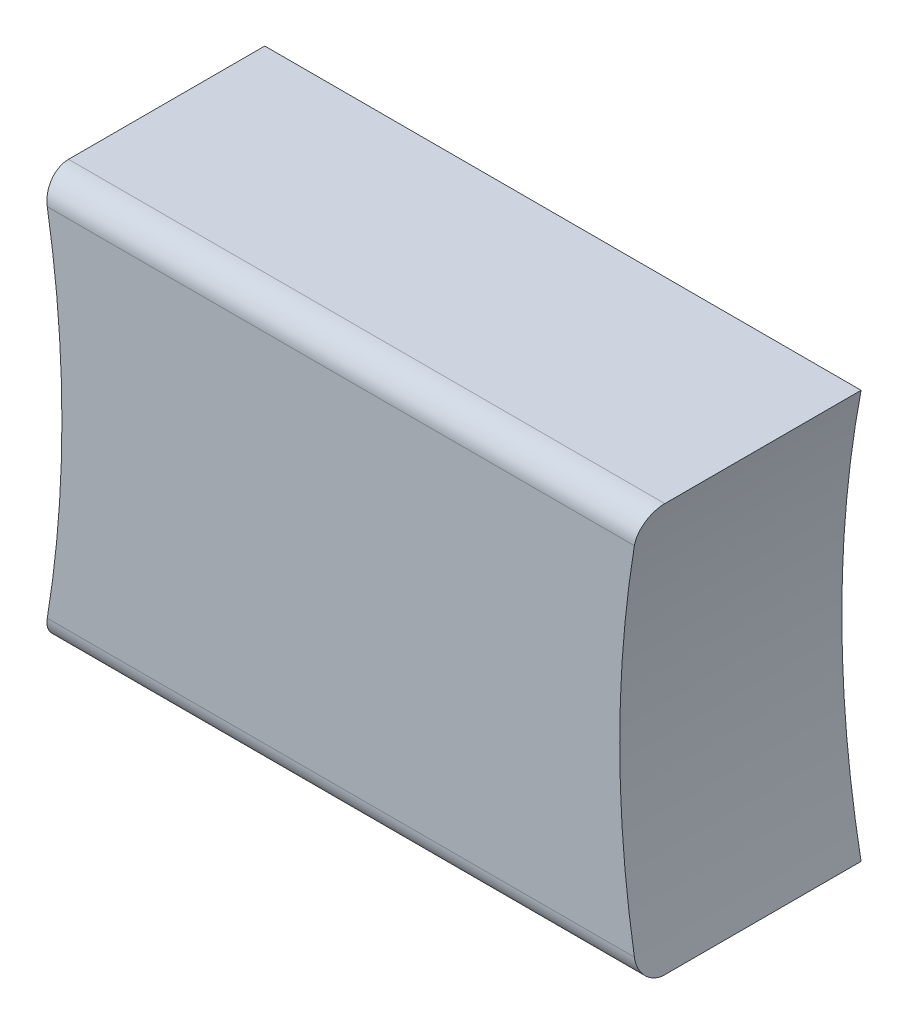
ISO-10303-21;
HEADER;
FILE_DESCRIPTION(('STEP AP214'),'2;1');
FILE_NAME('part.step','',(''),(''),'','','');
FILE_SCHEMA(('AUTOMOTIVE_DESIGN { 1 0 10303 214 1 1 1 1 }'));
ENDSEC;
DATA;
#1=APPLICATION_CONTEXT('core data for automotive mechanical design processes');
#2=APPLICATION_PROTOCOL_DEFINITION('international standard','automotive_design',2000,#1);
#3=PRODUCT_CONTEXT('',#1,'mechanical');
#4=PRODUCT('Part','Part','',(#3));
#5=PRODUCT_RELATED_PRODUCT_CATEGORY('part','',(#4));
#6=PRODUCT_DEFINITION_FORMATION('','',#4);
#7=PRODUCT_DEFINITION_CONTEXT('part definition',#1,'design');
#8=PRODUCT_DEFINITION('design','',#6,#7);
#9=PRODUCT_DEFINITION_SHAPE('','',#8);
#10=(LENGTH_UNIT() NAMED_UNIT(*) SI_UNIT(.MILLI.,.METRE.));
#11=(NAMED_UNIT(*) PLANE_ANGLE_UNIT() SI_UNIT($,.RADIAN.));
#12=(NAMED_UNIT(*) SI_UNIT($,.STERADIAN.) SOLID_ANGLE_UNIT());
#13=UNCERTAINTY_MEASURE_WITH_UNIT(LENGTH_MEASURE(1.E-05),#10,'distance_accuracy_value','');
#14=(GEOMETRIC_REPRESENTATION_CONTEXT(3) GLOBAL_UNCERTAINTY_ASSIGNED_CONTEXT((#13)) GLOBAL_UNIT_ASSIGNED_CONTEXT((#10,
#11,#12)) REPRESENTATION_CONTEXT('',''));
#15=CARTESIAN_POINT('',(0.,0.,0.));
#16=DIRECTION('',(0.,0.,1.));
#17=DIRECTION('',(1.,0.,0.));
#18=AXIS2_PLACEMENT_3D('',#15,#16,#17);
#19=CARTESIAN_POINT('',(0.,0.,0.96));
#20=DIRECTION('',(0.,0.,1.));
#21=DIRECTION('',(1.,0.,0.));
#22=AXIS2_PLACEMENT_3D('',#19,#20,#21);
#23=PLANE('',#22);
#24=CARTESIAN_POINT('',(5.306675110214,0.,0.96));
#25=DIRECTION('',(0.,0.,1.));
#26=DIRECTION('',(1.,0.,0.));
#27=AXIS2_PLACEMENT_3D('',#24,#25,#26);
#28=CIRCLE('',#27,4.226675110214);
#29=CARTESIAN_POINT('',(1.13670119095473,-0.69,0.96));
#30=VERTEX_POINT('',#29);
#31=CARTESIAN_POINT('',(1.13670119095473,0.69,0.96));
#32=VERTEX_POINT('',#31);
#33=EDGE_CURVE('E76',#30,#32,#28,.F.);
#34=ORIENTED_EDGE('',*,*,#33,.T.);
#35=DIRECTION('',(-1.,0.,0.));
#36=VECTOR('',#35,1.);
#37=CARTESIAN_POINT('',(0.8,0.69,0.96));
#38=LINE('',#37,#36);
#39=CARTESIAN_POINT('',(-1.13670119095473,0.69,0.96));
#40=VERTEX_POINT('',#39);
#41=EDGE_CURVE('E78',#40,#32,#38,.F.);
#42=ORIENTED_EDGE('',*,*,#41,.F.);
#43=CARTESIAN_POINT('',(-5.306675110214,0.,0.96));
#44=DIRECTION('',(0.,0.,1.));
#45=DIRECTION('',(1.,0.,0.));
#46=AXIS2_PLACEMENT_3D('',#43,#44,#45);
#47=CIRCLE('',#46,4.226675110214);
#48=CARTESIAN_POINT('',(-1.13670119095473,-0.690000000000022,0.96));
#49=VERTEX_POINT('',#48);
#50=EDGE_CURVE('E20',#40,#49,#47,.F.);
#51=ORIENTED_EDGE('',*,*,#50,.T.);
#52=DIRECTION('',(1.,0.,0.));
#53=VECTOR('',#52,1.);
#54=CARTESIAN_POINT('',(-0.8,-0.69,0.96));
#55=LINE('',#54,#53);
#56=EDGE_CURVE('E82',#30,#49,#55,.F.);
#57=ORIENTED_EDGE('',*,*,#56,.F.);
#58=EDGE_LOOP('',(#34,#42,#51,#57));
#59=FACE_BOUND('',#58,.T.);
#60=ADVANCED_FACE('F17',(#59),#23,.T.);
#61=CARTESIAN_POINT('',(-0.8,-0.69,0.86));
#62=DIRECTION('',(1.,0.,0.));
#63=DIRECTION('',(0.,1.,0.));
#64=AXIS2_PLACEMENT_3D('',#61,#62,#63);
#65=CYLINDRICAL_SURFACE('',#64,0.1);
#66=CARTESIAN_POINT('',(1.15448502698051,-0.79,0.86));
#67=CARTESIAN_POINT('',(1.15448631273305,-0.790005087146856,0.865556849639631));
#68=CARTESIAN_POINT('',(1.15439696772321,-0.789537143585381,0.871111614982859));
#69=CARTESIAN_POINT('',(1.15404666825362,-0.787693522979548,0.88205561211761));
#70=CARTESIAN_POINT('',(1.15378594045839,-0.786319044876082,0.887445052721079));
#71=CARTESIAN_POINT('',(1.15310238228103,-0.782699977102862,0.897914027570781));
#72=CARTESIAN_POINT('',(1.15267950514041,-0.780455136447335,0.902993471934174));
#73=CARTESIAN_POINT('',(1.15168915351814,-0.775165432988514,0.912700914484045));
#74=CARTESIAN_POINT('',(1.15112168197221,-0.77212058642789,0.917328921833518));
#75=CARTESIAN_POINT('',(1.14985867669438,-0.765291925059744,0.926045724651077));
#76=CARTESIAN_POINT('',(1.14916212522611,-0.761502221892582,0.930129757421531));
#77=CARTESIAN_POINT('',(1.147669745872,-0.753308820601576,0.937606435921475));
#78=CARTESIAN_POINT('',(1.14687389469198,-0.748904978381558,0.94099891893062));
#79=CARTESIAN_POINT('',(1.14519704768687,-0.739530821716076,0.947053709019323));
#80=CARTESIAN_POINT('',(1.14431486930304,-0.734552399877286,0.949703125369265));
#81=CARTESIAN_POINT('',(1.14250631710719,-0.724229350416601,0.954126784718131));
#82=CARTESIAN_POINT('',(1.1415799614916,-0.718884873182395,0.955901384693343));
#83=CARTESIAN_POINT('',(1.13998951770043,-0.709597645176679,0.958140330856203));
#84=CARTESIAN_POINT('',(1.13932902421101,-0.705708628600776,0.958837085209216));
#85=CARTESIAN_POINT('',(1.13801091925601,-0.69788056027493,0.959766918087541));
#86=CARTESIAN_POINT('',(1.13735330510573,-0.693941583033747,0.960000620340565));
#87=CARTESIAN_POINT('',(1.13670119095475,-0.690000000000307,0.960000000001108));
#88=B_SPLINE_CURVE_WITH_KNOTS('',3,(#66,#67,#68,#69,#70,#71,#72,#73,#74,#75,#76,#77,#78,#79,#80,
#81,#82,#83,#84,#85,#86,#87),.UNSPECIFIED.,.F.,.F.,(4,2,2,2,2,2,2,2,2,2,4),(0.,
0.0166470548257728,0.0332721370528381,0.0499020170119482,0.0665315593575657,0.083298273973887,
0.100068929224018,0.1171146910261,0.134153491390027,0.146145101109914,0.15812054721049),.UNSPECIFIED.);
#89=CARTESIAN_POINT('',(1.15448502698075,-0.789999999999999,0.86));
#90=VERTEX_POINT('',#89);
#91=EDGE_CURVE('E81',#90,#30,#88,.T.);
#92=ORIENTED_EDGE('',*,*,#91,.T.);
#93=ORIENTED_EDGE('',*,*,#56,.T.);
#94=CARTESIAN_POINT('',(-1.13670119095474,-0.690000000000044,0.96));
#95=CARTESIAN_POINT('',(-1.13764318933458,-0.695695699680427,0.960004430143567));
#96=CARTESIAN_POINT('',(-1.13859752881482,-0.701388029645846,0.959513652661241));
#97=CARTESIAN_POINT('',(-1.14050101488891,-0.712605937558877,0.95757620101457));
#98=CARTESIAN_POINT('',(-1.14145016366756,-0.718131590933031,0.956129966223132));
#99=CARTESIAN_POINT('',(-1.14331480683943,-0.728864499019192,0.952315049649415));
#100=CARTESIAN_POINT('',(-1.14423028313918,-0.734071583520771,0.949945879640663));
#101=CARTESIAN_POINT('',(-1.14599590347629,-0.74401375473485,0.944350610371908));
#102=CARTESIAN_POINT('',(-1.14684606347095,-0.748748956816436,0.941124721278886));
#103=CARTESIAN_POINT('',(-1.1484469432885,-0.757589032888459,0.933919507894515));
#104=CARTESIAN_POINT('',(-1.14919810311195,-0.761696709810781,0.929943722496007));
#105=CARTESIAN_POINT('',(-1.15057697965973,-0.769184859667577,0.921337471849207));
#106=CARTESIAN_POINT('',(-1.1512046775953,-0.772565221924776,0.916706907138946));
#107=CARTESIAN_POINT('',(-1.15230313861589,-0.778450305742095,0.906993118333624));
#108=CARTESIAN_POINT('',(-1.15277598685132,-0.780966685879153,0.901917185451791));
#109=CARTESIAN_POINT('',(-1.15355681632423,-0.785108529198617,0.891404124043471));
#110=CARTESIAN_POINT('',(-1.15386493483939,-0.786734734236377,0.885967300526919));
#111=CARTESIAN_POINT('',(-1.15421722820746,-0.788591478664703,0.877074155530164));
#112=CARTESIAN_POINT('',(-1.15431754491512,-0.789119352108425,0.873679271108409));
#113=CARTESIAN_POINT('',(-1.154451450244,-0.78982352938762,0.866856792314772));
#114=CARTESIAN_POINT('',(-1.15448513283932,-0.790000328344918,0.86342925086863));
#115=CARTESIAN_POINT('',(-1.15448502698045,-0.790000000000172,0.860000000000034));
#116=B_SPLINE_CURVE_WITH_KNOTS('',3,(#94,#95,#96,#97,#98,#99,#100,#101,#102,#103,#104,#105,#106,
#107,#108,#109,#110,#111,#112,#113,#114,#115),.UNSPECIFIED.,.F.,.F.,(4,2,2,2,2,2,2,2,2,2,4),(0.,
0.017296588390882,0.0345852283707785,0.0518830263702728,0.0691765848549443,0.0863904862874063,
0.103607005352155,0.120581122433749,0.137541071981785,0.147835299794453,0.158114999274042),.UNSPECIFIED.);
#117=CARTESIAN_POINT('',(-1.15448502698052,-0.790000000000023,0.86));
#118=VERTEX_POINT('',#117);
#119=EDGE_CURVE('E72',#49,#118,#116,.T.);
#120=ORIENTED_EDGE('',*,*,#119,.T.);
#121=DIRECTION('',(1.,0.,0.));
#122=VECTOR('',#121,1.);
#123=CARTESIAN_POINT('',(-1.6,-0.79,0.86));
#124=LINE('',#123,#122);
#125=EDGE_CURVE('E88',#90,#118,#124,.F.);
#126=ORIENTED_EDGE('',*,*,#125,.F.);
#127=EDGE_LOOP('',(#92,#93,#120,#126));
#128=FACE_BOUND('',#127,.T.);
#129=ADVANCED_FACE('F117',(#128),#65,.T.);
#130=CARTESIAN_POINT('',(0.8,0.69,0.86));
#131=DIRECTION('',(-1.,0.,0.));
#132=DIRECTION('',(0.,-1.,0.));
#133=AXIS2_PLACEMENT_3D('',#130,#131,#132);
#134=CYLINDRICAL_SURFACE('',#133,0.1);
#135=CARTESIAN_POINT('',(1.13670119095474,0.690000000000044,0.96));
#136=CARTESIAN_POINT('',(1.13764318933458,0.695695699680427,0.960004430143567));
#137=CARTESIAN_POINT('',(1.13859752881482,0.701388029645846,0.959513652661241));
#138=CARTESIAN_POINT('',(1.14050101488891,0.712605937558877,0.95757620101457));
#139=CARTESIAN_POINT('',(1.14145016366756,0.718131590933031,0.956129966223132));
#140=CARTESIAN_POINT('',(1.14331480683943,0.728864499019192,0.952315049649416));
#141=CARTESIAN_POINT('',(1.14423028313918,0.734071583520771,0.949945879640664));
#142=CARTESIAN_POINT('',(1.14599590347629,0.74401375473485,0.944350610371908));
#143=CARTESIAN_POINT('',(1.14684606347095,0.748748956816436,0.941124721278886));
#144=CARTESIAN_POINT('',(1.1484469432885,0.757589032888459,0.933919507894515));
#145=CARTESIAN_POINT('',(1.14919810311195,0.761696709810781,0.929943722496007));
#146=CARTESIAN_POINT('',(1.15057697965973,0.769184859667577,0.921337471849207));
#147=CARTESIAN_POINT('',(1.1512046775953,0.772565221924776,0.916706907138946));
#148=CARTESIAN_POINT('',(1.15230313861589,0.778450305742095,0.906993118333624));
#149=CARTESIAN_POINT('',(1.15277598685132,0.780966685879153,0.901917185451791));
#150=CARTESIAN_POINT('',(1.15355681632423,0.785108529198617,0.891404124043471));
#151=CARTESIAN_POINT('',(1.15386493483939,0.786734734236377,0.885967300526919));
#152=CARTESIAN_POINT('',(1.15421722820746,0.788591478664703,0.877074155530164));
#153=CARTESIAN_POINT('',(1.15431754491513,0.789119352108425,0.873679271108409));
#154=CARTESIAN_POINT('',(1.154451450244,0.78982352938762,0.866856792314772));
#155=CARTESIAN_POINT('',(1.15448513283932,0.790000328344918,0.86342925086863));
#156=CARTESIAN_POINT('',(1.15448502698045,0.790000000000172,0.860000000000033));
#157=B_SPLINE_CURVE_WITH_KNOTS('',3,(#135,#136,#137,#138,#139,#140,#141,#142,#143,#144,#145,
#146,#147,#148,#149,#150,#151,#152,#153,#154,#155,#156),.UNSPECIFIED.,.F.,.F.,(4,2,2,2,2,2,2,2,
2,2,4),(0.,0.017296588390882,0.0345852283707785,0.0518830263702727,0.0691765848549442,
0.0863904862874062,0.103607005352155,0.12058112243375,0.137541071981785,0.147835299794453,
0.158114999274042),.UNSPECIFIED.);
#158=CARTESIAN_POINT('',(1.15448502698076,0.79,0.86));
#159=VERTEX_POINT('',#158);
#160=EDGE_CURVE('E104',#32,#159,#157,.T.);
#161=ORIENTED_EDGE('',*,*,#160,.T.);
#162=DIRECTION('',(-1.,0.,0.));
#163=VECTOR('',#162,1.);
#164=CARTESIAN_POINT('',(1.6,0.79,0.86));
#165=LINE('',#164,#163);
#166=CARTESIAN_POINT('',(-1.15448502698076,0.79,0.86));
#167=VERTEX_POINT('',#166);
#168=EDGE_CURVE('E86',#167,#159,#165,.F.);
#169=ORIENTED_EDGE('',*,*,#168,.F.);
#170=CARTESIAN_POINT('',(-1.15448502698051,0.79,0.86));
#171=CARTESIAN_POINT('',(-1.15448631273305,0.790005087146856,0.865556849639631));
#172=CARTESIAN_POINT('',(-1.15439696772321,0.789537143585382,0.871111614982859));
#173=CARTESIAN_POINT('',(-1.15404666825362,0.787693522979548,0.88205561211761));
#174=CARTESIAN_POINT('',(-1.15378594045839,0.786319044876082,0.887445052721079));
#175=CARTESIAN_POINT('',(-1.15310238228103,0.782699977102862,0.897914027570781));
#176=CARTESIAN_POINT('',(-1.15267950514041,0.780455136447335,0.902993471934173));
#177=CARTESIAN_POINT('',(-1.15168915351814,0.775165432988514,0.912700914484045));
#178=CARTESIAN_POINT('',(-1.15112168197221,0.77212058642789,0.917328921833518));
#179=CARTESIAN_POINT('',(-1.14985867669438,0.765291925059744,0.926045724651077));
#180=CARTESIAN_POINT('',(-1.14916212522611,0.761502221892582,0.930129757421531));
#181=CARTESIAN_POINT('',(-1.147669745872,0.753308820601576,0.937606435921475));
#182=CARTESIAN_POINT('',(-1.14687389469198,0.748904978381558,0.94099891893062));
#183=CARTESIAN_POINT('',(-1.14519704768687,0.739530821716076,0.947053709019323));
#184=CARTESIAN_POINT('',(-1.14431486930304,0.734552399877286,0.949703125369265));
#185=CARTESIAN_POINT('',(-1.14250631710719,0.724229350416602,0.954126784718131));
#186=CARTESIAN_POINT('',(-1.1415799614916,0.718884873182395,0.955901384693343));
#187=CARTESIAN_POINT('',(-1.13998951770043,0.70959764517668,0.958140330856203));
#188=CARTESIAN_POINT('',(-1.13932902421102,0.705708628600777,0.958837085209216));
#189=CARTESIAN_POINT('',(-1.13801091925601,0.697880560274931,0.959766918087541));
#190=CARTESIAN_POINT('',(-1.13735330510573,0.693941583033747,0.960000620340565));
#191=CARTESIAN_POINT('',(-1.13670119095475,0.690000000000308,0.960000000001108));
#192=B_SPLINE_CURVE_WITH_KNOTS('',3,(#170,#171,#172,#173,#174,#175,#176,#177,#178,#179,#180,
#181,#182,#183,#184,#185,#186,#187,#188,#189,#190,#191),.UNSPECIFIED.,.F.,.F.,(4,2,2,2,2,2,2,2,
2,2,4),(0.,0.0166470548257727,0.0332721370528381,0.0499020170119481,0.0665315593575656,
0.0832982739738869,0.100068929224018,0.1171146910261,0.134153491390027,0.146145101109914,
0.15812054721049),.UNSPECIFIED.);
#193=EDGE_CURVE('E70',#167,#40,#192,.T.);
#194=ORIENTED_EDGE('',*,*,#193,.T.);
#195=ORIENTED_EDGE('',*,*,#41,.T.);
#196=EDGE_LOOP('',(#161,#169,#194,#195));
#197=FACE_BOUND('',#196,.T.);
#198=ADVANCED_FACE('F84',(#197),#134,.T.);
#199=CARTESIAN_POINT('',(5.306675110214,0.,0.96));
#200=DIRECTION('',(0.,0.,1.));
#201=DIRECTION('',(1.,0.,0.));
#202=AXIS2_PLACEMENT_3D('',#199,#200,#201);
#203=CYLINDRICAL_SURFACE('',#202,4.226675110214);
#204=DIRECTION('',(0.,0.,1.));
#205=VECTOR('',#204,1.);
#206=CARTESIAN_POINT('',(1.154485026981,0.79,0.));
#207=LINE('',#206,#205);
#208=CARTESIAN_POINT('',(1.15448502698076,0.79,0.1));
#209=VERTEX_POINT('',#208);
#210=EDGE_CURVE('E143',#159,#209,#207,.F.);
#211=ORIENTED_EDGE('',*,*,#210,.F.);
#212=ORIENTED_EDGE('',*,*,#160,.F.);
#213=ORIENTED_EDGE('',*,*,#33,.F.);
#214=ORIENTED_EDGE('',*,*,#91,.F.);
#215=DIRECTION('',(0.,0.,1.));
#216=VECTOR('',#215,1.);
#217=CARTESIAN_POINT('',(1.154485026981,-0.789999999999999,0.));
#218=LINE('',#217,#216);
#219=CARTESIAN_POINT('',(1.15448502698076,-0.79,0.1));
#220=VERTEX_POINT('',#219);
#221=EDGE_CURVE('E92',#220,#90,#218,.T.);
#222=ORIENTED_EDGE('',*,*,#221,.F.);
#223=CARTESIAN_POINT('',(5.306675110214,0.,0.1));
#224=DIRECTION('',(0.,0.,1.));
#225=DIRECTION('',(1.,0.,0.));
#226=AXIS2_PLACEMENT_3D('',#223,#224,#225);
#227=CIRCLE('',#226,4.226675110214);
#228=EDGE_CURVE('E102',#209,#220,#227,.T.);
#229=ORIENTED_EDGE('',*,*,#228,.F.);
#230=EDGE_LOOP('',(#211,#212,#213,#214,#222,#229));
#231=FACE_BOUND('',#230,.T.);
#232=ADVANCED_FACE('F116',(#231),#203,.F.);
#233=CARTESIAN_POINT('',(-1.6,-0.79,0.));
#234=DIRECTION('',(0.,-1.,0.));
#235=DIRECTION('',(1.,0.,0.));
#236=AXIS2_PLACEMENT_3D('',#233,#234,#235);
#237=PLANE('',#236);
#238=ORIENTED_EDGE('',*,*,#221,.T.);
#239=ORIENTED_EDGE('',*,*,#125,.T.);
#240=DIRECTION('',(0.,0.,1.));
#241=VECTOR('',#240,1.);
#242=CARTESIAN_POINT('',(-1.15448502698053,-0.790000000000092,0.96));
#243=LINE('',#242,#241);
#244=CARTESIAN_POINT('',(-1.15448502698052,-0.790000000000046,0.1));
#245=VERTEX_POINT('',#244);
#246=EDGE_CURVE('E87',#118,#245,#243,.F.);
#247=ORIENTED_EDGE('',*,*,#246,.T.);
#248=DIRECTION('',(-1.,0.,0.));
#249=VECTOR('',#248,1.);
#250=CARTESIAN_POINT('',(0.,-0.79,0.1));
#251=LINE('',#250,#249);
#252=EDGE_CURVE('E137',#220,#245,#251,.T.);
#253=ORIENTED_EDGE('',*,*,#252,.F.);
#254=EDGE_LOOP('',(#238,#239,#247,#253));
#255=FACE_BOUND('',#254,.T.);
#256=ADVANCED_FACE('F156',(#255),#237,.T.);
#257=CARTESIAN_POINT('',(-5.306675110214,0.,0.96));
#258=DIRECTION('',(0.,0.,1.));
#259=DIRECTION('',(1.,0.,0.));
#260=AXIS2_PLACEMENT_3D('',#257,#258,#259);
#261=CYLINDRICAL_SURFACE('',#260,4.226675110214);
#262=ORIENTED_EDGE('',*,*,#246,.F.);
#263=ORIENTED_EDGE('',*,*,#119,.F.);
#264=ORIENTED_EDGE('',*,*,#50,.F.);
#265=ORIENTED_EDGE('',*,*,#193,.F.);
#266=DIRECTION('',(0.,0.,1.));
#267=VECTOR('',#266,1.);
#268=CARTESIAN_POINT('',(-1.154485026981,0.79,0.));
#269=LINE('',#268,#267);
#270=CARTESIAN_POINT('',(-1.15448502698076,0.79,0.1));
#271=VERTEX_POINT('',#270);
#272=EDGE_CURVE('E35',#271,#167,#269,.T.);
#273=ORIENTED_EDGE('',*,*,#272,.F.);
#274=CARTESIAN_POINT('',(-5.306675110214,0.,0.1));
#275=DIRECTION('',(0.,0.,1.));
#276=DIRECTION('',(1.,0.,0.));
#277=AXIS2_PLACEMENT_3D('',#274,#275,#276);
#278=CIRCLE('',#277,4.226675110214);
#279=EDGE_CURVE('E26',#245,#271,#278,.T.);
#280=ORIENTED_EDGE('',*,*,#279,.F.);
#281=EDGE_LOOP('',(#262,#263,#264,#265,#273,#280));
#282=FACE_BOUND('',#281,.T.);
#283=ADVANCED_FACE('F68',(#282),#261,.F.);
#284=CARTESIAN_POINT('',(1.6,0.79,0.));
#285=DIRECTION('',(0.,1.,0.));
#286=DIRECTION('',(-1.,0.,0.));
#287=AXIS2_PLACEMENT_3D('',#284,#285,#286);
#288=PLANE('',#287);
#289=ORIENTED_EDGE('',*,*,#210,.T.);
#290=DIRECTION('',(-1.,0.,0.));
#291=VECTOR('',#290,1.);
#292=CARTESIAN_POINT('',(0.,0.79,0.1));
#293=LINE('',#292,#291);
#294=EDGE_CURVE('E11',#271,#209,#293,.F.);
#295=ORIENTED_EDGE('',*,*,#294,.F.);
#296=ORIENTED_EDGE('',*,*,#272,.T.);
#297=ORIENTED_EDGE('',*,*,#168,.T.);
#298=EDGE_LOOP('',(#289,#295,#296,#297));
#299=FACE_BOUND('',#298,.T.);
#300=ADVANCED_FACE('F151',(#299),#288,.T.);
#301=CARTESIAN_POINT('',(0.,0.,0.1));
#302=DIRECTION('',(0.,0.,-1.));
#303=DIRECTION('',(-1.,0.,0.));
#304=AXIS2_PLACEMENT_3D('',#301,#302,#303);
#305=PLANE('',#304);
#306=ORIENTED_EDGE('',*,*,#279,.T.);
#307=ORIENTED_EDGE('',*,*,#294,.T.);
#308=ORIENTED_EDGE('',*,*,#228,.T.);
#309=ORIENTED_EDGE('',*,*,#252,.T.);
#310=EDGE_LOOP('',(#306,#307,#308,#309));
#311=FACE_BOUND('',#310,.T.);
#312=ADVANCED_FACE('F153',(#311),#305,.T.);
#313=CLOSED_SHELL('',(#60,#129,#198,#232,#256,#283,#300,#312));
#314=MANIFOLD_SOLID_BREP('B1',#313);
#315=ADVANCED_BREP_SHAPE_REPRESENTATION('',(#18,#314),#14);
#316=SHAPE_DEFINITION_REPRESENTATION(#9,#315);
ENDSEC;
END-ISO-10303-21;
